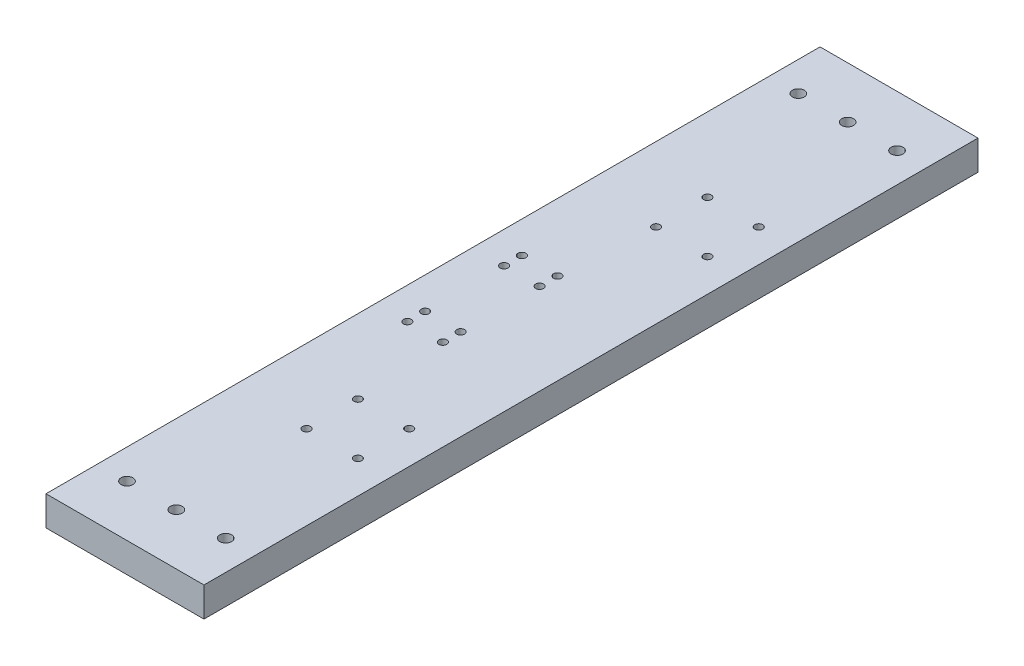
ISO-10303-21;
HEADER;
FILE_DESCRIPTION(('STEP AP214'),'2;1');
FILE_NAME('part.step','',(''),(''),'','','');
FILE_SCHEMA(('AUTOMOTIVE_DESIGN { 1 0 10303 214 1 1 1 1 }'));
ENDSEC;
DATA;
#1=APPLICATION_CONTEXT('core data for automotive mechanical design processes');
#2=APPLICATION_PROTOCOL_DEFINITION('international standard','automotive_design',2000,#1);
#3=PRODUCT_CONTEXT('',#1,'mechanical');
#4=PRODUCT('Part','Part','',(#3));
#5=PRODUCT_RELATED_PRODUCT_CATEGORY('part','',(#4));
#6=PRODUCT_DEFINITION_FORMATION('','',#4);
#7=PRODUCT_DEFINITION_CONTEXT('part definition',#1,'design');
#8=PRODUCT_DEFINITION('design','',#6,#7);
#9=PRODUCT_DEFINITION_SHAPE('','',#8);
#10=(LENGTH_UNIT() NAMED_UNIT(*) SI_UNIT(.MILLI.,.METRE.));
#11=(NAMED_UNIT(*) PLANE_ANGLE_UNIT() SI_UNIT($,.RADIAN.));
#12=(NAMED_UNIT(*) SI_UNIT($,.STERADIAN.) SOLID_ANGLE_UNIT());
#13=UNCERTAINTY_MEASURE_WITH_UNIT(LENGTH_MEASURE(1.E-05),#10,'distance_accuracy_value','');
#14=(GEOMETRIC_REPRESENTATION_CONTEXT(3) GLOBAL_UNCERTAINTY_ASSIGNED_CONTEXT((#13)) GLOBAL_UNIT_ASSIGNED_CONTEXT((#10,
#11,#12)) REPRESENTATION_CONTEXT('',''));
#15=CARTESIAN_POINT('',(0.,0.,0.));
#16=DIRECTION('',(0.,0.,1.));
#17=DIRECTION('',(1.,0.,0.));
#18=AXIS2_PLACEMENT_3D('',#15,#16,#17);
#19=CARTESIAN_POINT('',(0.,0.,392.));
#20=DIRECTION('',(1.,0.,0.));
#21=DIRECTION('',(0.,0.,-1.));
#22=AXIS2_PLACEMENT_3D('',#19,#20,#21);
#23=PLANE('',#22);
#24=DIRECTION('',(0.,-1.,0.));
#25=VECTOR('',#24,1.);
#26=CARTESIAN_POINT('',(0.,0.,0.));
#27=LINE('',#26,#25);
#28=CARTESIAN_POINT('',(0.,15.,0.));
#29=VERTEX_POINT('',#28);
#30=CARTESIAN_POINT('',(0.,0.,0.));
#31=VERTEX_POINT('',#30);
#32=EDGE_CURVE('E110',#29,#31,#27,.T.);
#33=ORIENTED_EDGE('',*,*,#32,.T.);
#34=DIRECTION('',(0.,0.,-1.));
#35=VECTOR('',#34,1.);
#36=CARTESIAN_POINT('',(0.,0.,392.));
#37=LINE('',#36,#35);
#38=CARTESIAN_POINT('',(0.,0.,392.));
#39=VERTEX_POINT('',#38);
#40=EDGE_CURVE('E11',#39,#31,#37,.T.);
#41=ORIENTED_EDGE('',*,*,#40,.F.);
#42=DIRECTION('',(0.,-1.,0.));
#43=VECTOR('',#42,1.);
#44=CARTESIAN_POINT('',(0.,0.,392.));
#45=LINE('',#44,#43);
#46=CARTESIAN_POINT('',(0.,15.,392.));
#47=VERTEX_POINT('',#46);
#48=EDGE_CURVE('E93',#47,#39,#45,.T.);
#49=ORIENTED_EDGE('',*,*,#48,.F.);
#50=DIRECTION('',(0.,0.,-1.));
#51=VECTOR('',#50,1.);
#52=CARTESIAN_POINT('',(0.,15.,392.));
#53=LINE('',#52,#51);
#54=EDGE_CURVE('E106',#47,#29,#53,.T.);
#55=ORIENTED_EDGE('',*,*,#54,.T.);
#56=EDGE_LOOP('',(#33,#41,#49,#55));
#57=FACE_BOUND('',#56,.T.);
#58=ADVANCED_FACE('F41',(#57),#23,.F.);
#59=CARTESIAN_POINT('',(0.,0.,392.));
#60=DIRECTION('',(0.,1.,0.));
#61=DIRECTION('',(0.,0.,1.));
#62=AXIS2_PLACEMENT_3D('',#59,#60,#61);
#63=PLANE('',#62);
#64=CARTESIAN_POINT('',(37.4499999999999,0.,94.5000000000002));
#65=DIRECTION('',(0.,1.,0.));
#66=DIRECTION('',(0.,0.,1.));
#67=AXIS2_PLACEMENT_3D('',#64,#65,#66);
#68=CIRCLE('',#67,2.);
#69=CARTESIAN_POINT('',(37.4499999999999,0.,96.5000000000002));
#70=VERTEX_POINT('',#69);
#71=EDGE_CURVE('E278',#70,#70,#68,.T.);
#72=ORIENTED_EDGE('',*,*,#71,.T.);
#73=EDGE_LOOP('',(#72));
#74=FACE_BOUND('',#73,.T.);
#75=CARTESIAN_POINT('',(37.45,0.,120.5));
#76=DIRECTION('',(0.,1.,0.));
#77=DIRECTION('',(0.,0.,1.));
#78=AXIS2_PLACEMENT_3D('',#75,#76,#77);
#79=CIRCLE('',#78,2.);
#80=CARTESIAN_POINT('',(37.45,0.,122.5));
#81=VERTEX_POINT('',#80);
#82=EDGE_CURVE('E270',#81,#81,#79,.T.);
#83=ORIENTED_EDGE('',*,*,#82,.T.);
#84=EDGE_LOOP('',(#83));
#85=FACE_BOUND('',#84,.T.);
#86=CARTESIAN_POINT('',(63.45,0.,120.5));
#87=DIRECTION('',(0.,1.,0.));
#88=DIRECTION('',(0.,0.,1.));
#89=AXIS2_PLACEMENT_3D('',#86,#87,#88);
#90=CIRCLE('',#89,2.);
#91=CARTESIAN_POINT('',(63.45,0.,122.5));
#92=VERTEX_POINT('',#91);
#93=EDGE_CURVE('E262',#92,#92,#90,.T.);
#94=ORIENTED_EDGE('',*,*,#93,.T.);
#95=EDGE_LOOP('',(#94));
#96=FACE_BOUND('',#95,.T.);
#97=CARTESIAN_POINT('',(63.45,0.,271.5));
#98=DIRECTION('',(0.,1.,0.));
#99=DIRECTION('',(0.,0.,-1.));
#100=AXIS2_PLACEMENT_3D('',#97,#98,#99);
#101=CIRCLE('',#100,2.);
#102=CARTESIAN_POINT('',(63.45,0.,269.5));
#103=VERTEX_POINT('',#102);
#104=EDGE_CURVE('E253',#103,#103,#101,.T.);
#105=ORIENTED_EDGE('',*,*,#104,.T.);
#106=EDGE_LOOP('',(#105));
#107=FACE_BOUND('',#106,.T.);
#108=CARTESIAN_POINT('',(37.45,0.,271.5));
#109=DIRECTION('',(0.,1.,0.));
#110=DIRECTION('',(0.,0.,-1.));
#111=AXIS2_PLACEMENT_3D('',#108,#109,#110);
#112=CIRCLE('',#111,2.);
#113=CARTESIAN_POINT('',(37.45,0.,269.5));
#114=VERTEX_POINT('',#113);
#115=EDGE_CURVE('E301',#114,#114,#112,.T.);
#116=ORIENTED_EDGE('',*,*,#115,.T.);
#117=EDGE_LOOP('',(#116));
#118=FACE_BOUND('',#117,.T.);
#119=CARTESIAN_POINT('',(37.4499999999999,0.,297.5));
#120=DIRECTION('',(0.,1.,0.));
#121=DIRECTION('',(0.,0.,-1.));
#122=AXIS2_PLACEMENT_3D('',#119,#120,#121);
#123=CIRCLE('',#122,2.);
#124=CARTESIAN_POINT('',(37.4499999999999,0.,295.5));
#125=VERTEX_POINT('',#124);
#126=EDGE_CURVE('E293',#125,#125,#123,.T.);
#127=ORIENTED_EDGE('',*,*,#126,.T.);
#128=EDGE_LOOP('',(#127));
#129=FACE_BOUND('',#128,.T.);
#130=CARTESIAN_POINT('',(63.4499999999999,0.,297.5));
#131=DIRECTION('',(0.,1.,0.));
#132=DIRECTION('',(0.,0.,-1.));
#133=AXIS2_PLACEMENT_3D('',#130,#131,#132);
#134=CIRCLE('',#133,2.);
#135=CARTESIAN_POINT('',(63.4499999999999,0.,295.5));
#136=VERTEX_POINT('',#135);
#137=EDGE_CURVE('E285',#136,#136,#134,.T.);
#138=ORIENTED_EDGE('',*,*,#137,.T.);
#139=EDGE_LOOP('',(#138));
#140=FACE_BOUND('',#139,.T.);
#141=CARTESIAN_POINT('',(63.4499999999999,0.,94.5000000000001));
#142=DIRECTION('',(0.,1.,0.));
#143=DIRECTION('',(0.,0.,1.));
#144=AXIS2_PLACEMENT_3D('',#141,#142,#143);
#145=CIRCLE('',#144,2.);
#146=CARTESIAN_POINT('',(63.4499999999999,0.,96.5000000000001));
#147=VERTEX_POINT('',#146);
#148=EDGE_CURVE('E226',#147,#147,#145,.T.);
#149=ORIENTED_EDGE('',*,*,#148,.T.);
#150=EDGE_LOOP('',(#149));
#151=FACE_BOUND('',#150,.T.);
#152=CARTESIAN_POINT('',(34.0000000000011,0.,225.));
#153=DIRECTION('',(0.,-1.,0.));
#154=DIRECTION('',(0.,0.,-1.));
#155=AXIS2_PLACEMENT_3D('',#152,#153,#154);
#156=CIRCLE('',#155,2.);
#157=CARTESIAN_POINT('',(34.0000000000011,0.,223.));
#158=VERTEX_POINT('',#157);
#159=EDGE_CURVE('E185',#158,#158,#156,.T.);
#160=ORIENTED_EDGE('',*,*,#159,.F.);
#161=EDGE_LOOP('',(#160));
#162=FACE_BOUND('',#161,.T.);
#163=CARTESIAN_POINT('',(16.0000000000011,0.,225.));
#164=DIRECTION('',(0.,-1.,0.));
#165=DIRECTION('',(0.,0.,-1.));
#166=AXIS2_PLACEMENT_3D('',#163,#164,#165);
#167=CIRCLE('',#166,2.);
#168=CARTESIAN_POINT('',(16.0000000000011,0.,223.));
#169=VERTEX_POINT('',#168);
#170=EDGE_CURVE('E210',#169,#169,#167,.T.);
#171=ORIENTED_EDGE('',*,*,#170,.F.);
#172=EDGE_LOOP('',(#171));
#173=FACE_BOUND('',#172,.T.);
#174=CARTESIAN_POINT('',(16.0000000000011,0.,216.));
#175=DIRECTION('',(0.,-1.,0.));
#176=DIRECTION('',(0.,0.,-1.));
#177=AXIS2_PLACEMENT_3D('',#174,#175,#176);
#178=CIRCLE('',#177,2.);
#179=CARTESIAN_POINT('',(16.0000000000011,0.,214.));
#180=VERTEX_POINT('',#179);
#181=EDGE_CURVE('E202',#180,#180,#178,.T.);
#182=ORIENTED_EDGE('',*,*,#181,.F.);
#183=EDGE_LOOP('',(#182));
#184=FACE_BOUND('',#183,.T.);
#185=CARTESIAN_POINT('',(15.9999999999999,0.,176.));
#186=DIRECTION('',(0.,-1.,0.));
#187=DIRECTION('',(0.,0.,1.));
#188=AXIS2_PLACEMENT_3D('',#185,#186,#187);
#189=CIRCLE('',#188,2.);
#190=CARTESIAN_POINT('',(15.9999999999999,0.,178.));
#191=VERTEX_POINT('',#190);
#192=EDGE_CURVE('E193',#191,#191,#189,.T.);
#193=ORIENTED_EDGE('',*,*,#192,.F.);
#194=EDGE_LOOP('',(#193));
#195=FACE_BOUND('',#194,.T.);
#196=CARTESIAN_POINT('',(16.0000000000011,0.,167.));
#197=DIRECTION('',(0.,-1.,0.));
#198=DIRECTION('',(0.,0.,1.));
#199=AXIS2_PLACEMENT_3D('',#196,#197,#198);
#200=CIRCLE('',#199,2.);
#201=CARTESIAN_POINT('',(16.0000000000011,0.,169.));
#202=VERTEX_POINT('',#201);
#203=EDGE_CURVE('E194',#202,#202,#200,.T.);
#204=ORIENTED_EDGE('',*,*,#203,.F.);
#205=EDGE_LOOP('',(#204));
#206=FACE_BOUND('',#205,.T.);
#207=CARTESIAN_POINT('',(34.0000000000011,0.,167.));
#208=DIRECTION('',(0.,-1.,0.));
#209=DIRECTION('',(0.,0.,1.));
#210=AXIS2_PLACEMENT_3D('',#207,#208,#209);
#211=CIRCLE('',#210,2.);
#212=CARTESIAN_POINT('',(34.0000000000011,0.,169.));
#213=VERTEX_POINT('',#212);
#214=EDGE_CURVE('E234',#213,#213,#211,.T.);
#215=ORIENTED_EDGE('',*,*,#214,.F.);
#216=EDGE_LOOP('',(#215));
#217=FACE_BOUND('',#216,.T.);
#218=CARTESIAN_POINT('',(33.9999999999999,0.,176.));
#219=DIRECTION('',(0.,-1.,0.));
#220=DIRECTION('',(0.,0.,1.));
#221=AXIS2_PLACEMENT_3D('',#218,#219,#220);
#222=CIRCLE('',#221,2.);
#223=CARTESIAN_POINT('',(33.9999999999999,0.,178.));
#224=VERTEX_POINT('',#223);
#225=EDGE_CURVE('E225',#224,#224,#222,.T.);
#226=ORIENTED_EDGE('',*,*,#225,.F.);
#227=EDGE_LOOP('',(#226));
#228=FACE_BOUND('',#227,.T.);
#229=CARTESIAN_POINT('',(34.0000000000011,0.,216.));
#230=DIRECTION('',(0.,-1.,0.));
#231=DIRECTION('',(0.,0.,-1.));
#232=AXIS2_PLACEMENT_3D('',#229,#230,#231);
#233=CIRCLE('',#232,2.);
#234=CARTESIAN_POINT('',(34.0000000000011,0.,214.));
#235=VERTEX_POINT('',#234);
#236=EDGE_CURVE('E181',#235,#235,#233,.T.);
#237=ORIENTED_EDGE('',*,*,#236,.F.);
#238=EDGE_LOOP('',(#237));
#239=FACE_BOUND('',#238,.T.);
#240=CARTESIAN_POINT('',(65.0000000000006,0.,366.));
#241=DIRECTION('',(0.,1.,0.));
#242=DIRECTION('',(0.,0.,-1.));
#243=AXIS2_PLACEMENT_3D('',#240,#241,#242);
#244=CIRCLE('',#243,3.00000000000001);
#245=CARTESIAN_POINT('',(65.0000000000006,0.,363.));
#246=VERTEX_POINT('',#245);
#247=EDGE_CURVE('E141',#246,#246,#244,.T.);
#248=ORIENTED_EDGE('',*,*,#247,.T.);
#249=EDGE_LOOP('',(#248));
#250=FACE_BOUND('',#249,.T.);
#251=CARTESIAN_POINT('',(40.0000000000006,0.,366.));
#252=DIRECTION('',(0.,1.,0.));
#253=DIRECTION('',(0.,0.,-1.));
#254=AXIS2_PLACEMENT_3D('',#251,#252,#253);
#255=CIRCLE('',#254,3.);
#256=CARTESIAN_POINT('',(40.0000000000006,0.,363.));
#257=VERTEX_POINT('',#256);
#258=EDGE_CURVE('E150',#257,#257,#255,.T.);
#259=ORIENTED_EDGE('',*,*,#258,.T.);
#260=EDGE_LOOP('',(#259));
#261=FACE_BOUND('',#260,.T.);
#262=CARTESIAN_POINT('',(15.0000000000006,0.,366.));
#263=DIRECTION('',(0.,1.,0.));
#264=DIRECTION('',(0.,0.,-1.));
#265=AXIS2_PLACEMENT_3D('',#262,#263,#264);
#266=CIRCLE('',#265,3.);
#267=CARTESIAN_POINT('',(15.0000000000006,0.,363.));
#268=VERTEX_POINT('',#267);
#269=EDGE_CURVE('E158',#268,#268,#266,.T.);
#270=ORIENTED_EDGE('',*,*,#269,.T.);
#271=EDGE_LOOP('',(#270));
#272=FACE_BOUND('',#271,.T.);
#273=CARTESIAN_POINT('',(15.0000000000019,0.,26.0000000000003));
#274=DIRECTION('',(0.,1.,0.));
#275=DIRECTION('',(0.,0.,1.));
#276=AXIS2_PLACEMENT_3D('',#273,#274,#275);
#277=CIRCLE('',#276,3.);
#278=CARTESIAN_POINT('',(15.0000000000019,0.,29.0000000000003));
#279=VERTEX_POINT('',#278);
#280=EDGE_CURVE('E166',#279,#279,#277,.T.);
#281=ORIENTED_EDGE('',*,*,#280,.T.);
#282=EDGE_LOOP('',(#281));
#283=FACE_BOUND('',#282,.T.);
#284=CARTESIAN_POINT('',(40.0000000000019,0.,26.0000000000004));
#285=DIRECTION('',(0.,1.,0.));
#286=DIRECTION('',(0.,0.,1.));
#287=AXIS2_PLACEMENT_3D('',#284,#285,#286);
#288=CIRCLE('',#287,3.);
#289=CARTESIAN_POINT('',(40.0000000000019,0.,29.0000000000004));
#290=VERTEX_POINT('',#289);
#291=EDGE_CURVE('E174',#290,#290,#288,.T.);
#292=ORIENTED_EDGE('',*,*,#291,.T.);
#293=EDGE_LOOP('',(#292));
#294=FACE_BOUND('',#293,.T.);
#295=CARTESIAN_POINT('',(65.0000000000019,0.,26.0000000000005));
#296=DIRECTION('',(0.,1.,0.));
#297=DIRECTION('',(0.,0.,1.));
#298=AXIS2_PLACEMENT_3D('',#295,#296,#297);
#299=CIRCLE('',#298,3.00000000000001);
#300=CARTESIAN_POINT('',(65.0000000000019,0.,29.0000000000005));
#301=VERTEX_POINT('',#300);
#302=EDGE_CURVE('E114',#301,#301,#299,.T.);
#303=ORIENTED_EDGE('',*,*,#302,.T.);
#304=EDGE_LOOP('',(#303));
#305=FACE_BOUND('',#304,.T.);
#306=DIRECTION('',(1.,0.,0.));
#307=VECTOR('',#306,1.);
#308=CARTESIAN_POINT('',(0.,0.,0.));
#309=LINE('',#308,#307);
#310=CARTESIAN_POINT('',(80.,0.,0.));
#311=VERTEX_POINT('',#310);
#312=EDGE_CURVE('E98',#31,#311,#309,.T.);
#313=ORIENTED_EDGE('',*,*,#312,.T.);
#314=DIRECTION('',(0.,0.,-1.));
#315=VECTOR('',#314,1.);
#316=CARTESIAN_POINT('',(80.,0.,392.));
#317=LINE('',#316,#315);
#318=CARTESIAN_POINT('',(80.,0.,392.));
#319=VERTEX_POINT('',#318);
#320=EDGE_CURVE('E50',#319,#311,#317,.T.);
#321=ORIENTED_EDGE('',*,*,#320,.F.);
#322=DIRECTION('',(1.,0.,0.));
#323=VECTOR('',#322,1.);
#324=CARTESIAN_POINT('',(0.,0.,392.));
#325=LINE('',#324,#323);
#326=EDGE_CURVE('E88',#39,#319,#325,.T.);
#327=ORIENTED_EDGE('',*,*,#326,.F.);
#328=ORIENTED_EDGE('',*,*,#40,.T.);
#329=EDGE_LOOP('',(#313,#321,#327,#328));
#330=FACE_BOUND('',#329,.T.);
#331=ADVANCED_FACE('F97',(#74,#85,#96,#107,#118,#129,#140,#151,#162,#173,#184,#195,#206,#217,
#228,#239,#250,#261,#272,#283,#294,#305,#330),#63,.F.);
#332=CARTESIAN_POINT('',(80.,0.,392.));
#333=DIRECTION('',(-1.,0.,0.));
#334=DIRECTION('',(0.,0.,1.));
#335=AXIS2_PLACEMENT_3D('',#332,#333,#334);
#336=PLANE('',#335);
#337=DIRECTION('',(0.,1.,0.));
#338=VECTOR('',#337,1.);
#339=CARTESIAN_POINT('',(80.,0.,0.));
#340=LINE('',#339,#338);
#341=CARTESIAN_POINT('',(80.,15.,0.));
#342=VERTEX_POINT('',#341);
#343=EDGE_CURVE('E75',#311,#342,#340,.T.);
#344=ORIENTED_EDGE('',*,*,#343,.T.);
#345=DIRECTION('',(0.,0.,-1.));
#346=VECTOR('',#345,1.);
#347=CARTESIAN_POINT('',(80.,15.,392.));
#348=LINE('',#347,#346);
#349=CARTESIAN_POINT('',(80.,15.,392.));
#350=VERTEX_POINT('',#349);
#351=EDGE_CURVE('E100',#350,#342,#348,.T.);
#352=ORIENTED_EDGE('',*,*,#351,.F.);
#353=DIRECTION('',(0.,1.,0.));
#354=VECTOR('',#353,1.);
#355=CARTESIAN_POINT('',(80.,0.,392.));
#356=LINE('',#355,#354);
#357=EDGE_CURVE('E91',#319,#350,#356,.T.);
#358=ORIENTED_EDGE('',*,*,#357,.F.);
#359=ORIENTED_EDGE('',*,*,#320,.T.);
#360=EDGE_LOOP('',(#344,#352,#358,#359));
#361=FACE_BOUND('',#360,.T.);
#362=ADVANCED_FACE('F101',(#361),#336,.F.);
#363=CARTESIAN_POINT('',(0.,15.,392.));
#364=DIRECTION('',(0.,-1.,0.));
#365=DIRECTION('',(0.,0.,-1.));
#366=AXIS2_PLACEMENT_3D('',#363,#364,#365);
#367=PLANE('',#366);
#368=CARTESIAN_POINT('',(37.4499999999999,15.,94.5000000000002));
#369=DIRECTION('',(0.,1.,0.));
#370=DIRECTION('',(0.,0.,1.));
#371=AXIS2_PLACEMENT_3D('',#368,#369,#370);
#372=CIRCLE('',#371,2.);
#373=CARTESIAN_POINT('',(37.4499999999999,15.,96.5000000000002));
#374=VERTEX_POINT('',#373);
#375=EDGE_CURVE('E249',#374,#374,#372,.T.);
#376=ORIENTED_EDGE('',*,*,#375,.F.);
#377=EDGE_LOOP('',(#376));
#378=FACE_BOUND('',#377,.T.);
#379=CARTESIAN_POINT('',(37.45,15.,120.5));
#380=DIRECTION('',(0.,1.,0.));
#381=DIRECTION('',(0.,0.,1.));
#382=AXIS2_PLACEMENT_3D('',#379,#380,#381);
#383=CIRCLE('',#382,2.);
#384=CARTESIAN_POINT('',(37.45,15.,122.5));
#385=VERTEX_POINT('',#384);
#386=EDGE_CURVE('E274',#385,#385,#383,.T.);
#387=ORIENTED_EDGE('',*,*,#386,.F.);
#388=EDGE_LOOP('',(#387));
#389=FACE_BOUND('',#388,.T.);
#390=CARTESIAN_POINT('',(63.45,15.,120.5));
#391=DIRECTION('',(0.,1.,0.));
#392=DIRECTION('',(0.,0.,1.));
#393=AXIS2_PLACEMENT_3D('',#390,#391,#392);
#394=CIRCLE('',#393,2.);
#395=CARTESIAN_POINT('',(63.45,15.,122.5));
#396=VERTEX_POINT('',#395);
#397=EDGE_CURVE('E266',#396,#396,#394,.T.);
#398=ORIENTED_EDGE('',*,*,#397,.F.);
#399=EDGE_LOOP('',(#398));
#400=FACE_BOUND('',#399,.T.);
#401=CARTESIAN_POINT('',(63.45,15.,271.5));
#402=DIRECTION('',(0.,1.,0.));
#403=DIRECTION('',(0.,0.,-1.));
#404=AXIS2_PLACEMENT_3D('',#401,#402,#403);
#405=CIRCLE('',#404,2.);
#406=CARTESIAN_POINT('',(63.45,15.,269.5));
#407=VERTEX_POINT('',#406);
#408=EDGE_CURVE('E257',#407,#407,#405,.T.);
#409=ORIENTED_EDGE('',*,*,#408,.F.);
#410=EDGE_LOOP('',(#409));
#411=FACE_BOUND('',#410,.T.);
#412=CARTESIAN_POINT('',(37.45,15.,271.5));
#413=DIRECTION('',(0.,1.,0.));
#414=DIRECTION('',(0.,0.,-1.));
#415=AXIS2_PLACEMENT_3D('',#412,#413,#414);
#416=CIRCLE('',#415,2.);
#417=CARTESIAN_POINT('',(37.45,15.,269.5));
#418=VERTEX_POINT('',#417);
#419=EDGE_CURVE('E258',#418,#418,#416,.T.);
#420=ORIENTED_EDGE('',*,*,#419,.F.);
#421=EDGE_LOOP('',(#420));
#422=FACE_BOUND('',#421,.T.);
#423=CARTESIAN_POINT('',(37.4499999999999,15.,297.5));
#424=DIRECTION('',(0.,1.,0.));
#425=DIRECTION('',(0.,0.,-1.));
#426=AXIS2_PLACEMENT_3D('',#423,#424,#425);
#427=CIRCLE('',#426,2.);
#428=CARTESIAN_POINT('',(37.4499999999999,15.,295.5));
#429=VERTEX_POINT('',#428);
#430=EDGE_CURVE('E297',#429,#429,#427,.T.);
#431=ORIENTED_EDGE('',*,*,#430,.F.);
#432=EDGE_LOOP('',(#431));
#433=FACE_BOUND('',#432,.T.);
#434=CARTESIAN_POINT('',(63.4499999999999,15.,297.5));
#435=DIRECTION('',(0.,1.,0.));
#436=DIRECTION('',(0.,0.,-1.));
#437=AXIS2_PLACEMENT_3D('',#434,#435,#436);
#438=CIRCLE('',#437,2.);
#439=CARTESIAN_POINT('',(63.4499999999999,15.,295.5));
#440=VERTEX_POINT('',#439);
#441=EDGE_CURVE('E289',#440,#440,#438,.T.);
#442=ORIENTED_EDGE('',*,*,#441,.F.);
#443=EDGE_LOOP('',(#442));
#444=FACE_BOUND('',#443,.T.);
#445=CARTESIAN_POINT('',(63.4499999999999,15.,94.5000000000001));
#446=DIRECTION('',(0.,1.,0.));
#447=DIRECTION('',(0.,0.,1.));
#448=AXIS2_PLACEMENT_3D('',#445,#446,#447);
#449=CIRCLE('',#448,2.);
#450=CARTESIAN_POINT('',(63.4499999999999,15.,96.5000000000001));
#451=VERTEX_POINT('',#450);
#452=EDGE_CURVE('E245',#451,#451,#449,.T.);
#453=ORIENTED_EDGE('',*,*,#452,.F.);
#454=EDGE_LOOP('',(#453));
#455=FACE_BOUND('',#454,.T.);
#456=CARTESIAN_POINT('',(34.0000000000011,15.,225.));
#457=DIRECTION('',(0.,-1.,0.));
#458=DIRECTION('',(0.,0.,-1.));
#459=AXIS2_PLACEMENT_3D('',#456,#457,#458);
#460=CIRCLE('',#459,2.);
#461=CARTESIAN_POINT('',(34.0000000000011,15.,223.));
#462=VERTEX_POINT('',#461);
#463=EDGE_CURVE('E214',#462,#462,#460,.T.);
#464=ORIENTED_EDGE('',*,*,#463,.T.);
#465=EDGE_LOOP('',(#464));
#466=FACE_BOUND('',#465,.T.);
#467=CARTESIAN_POINT('',(16.0000000000011,15.,225.));
#468=DIRECTION('',(0.,-1.,0.));
#469=DIRECTION('',(0.,0.,-1.));
#470=AXIS2_PLACEMENT_3D('',#467,#468,#469);
#471=CIRCLE('',#470,2.);
#472=CARTESIAN_POINT('',(16.0000000000011,15.,223.));
#473=VERTEX_POINT('',#472);
#474=EDGE_CURVE('E206',#473,#473,#471,.T.);
#475=ORIENTED_EDGE('',*,*,#474,.T.);
#476=EDGE_LOOP('',(#475));
#477=FACE_BOUND('',#476,.T.);
#478=CARTESIAN_POINT('',(16.0000000000011,15.,216.));
#479=DIRECTION('',(0.,-1.,0.));
#480=DIRECTION('',(0.,0.,-1.));
#481=AXIS2_PLACEMENT_3D('',#478,#479,#480);
#482=CIRCLE('',#481,2.);
#483=CARTESIAN_POINT('',(16.0000000000011,15.,214.));
#484=VERTEX_POINT('',#483);
#485=EDGE_CURVE('E198',#484,#484,#482,.T.);
#486=ORIENTED_EDGE('',*,*,#485,.T.);
#487=EDGE_LOOP('',(#486));
#488=FACE_BOUND('',#487,.T.);
#489=CARTESIAN_POINT('',(15.9999999999999,15.,176.));
#490=DIRECTION('',(0.,-1.,0.));
#491=DIRECTION('',(0.,0.,1.));
#492=AXIS2_PLACEMENT_3D('',#489,#490,#491);
#493=CIRCLE('',#492,2.);
#494=CARTESIAN_POINT('',(15.9999999999999,15.,178.));
#495=VERTEX_POINT('',#494);
#496=EDGE_CURVE('E189',#495,#495,#493,.T.);
#497=ORIENTED_EDGE('',*,*,#496,.T.);
#498=EDGE_LOOP('',(#497));
#499=FACE_BOUND('',#498,.T.);
#500=CARTESIAN_POINT('',(16.0000000000011,15.,167.));
#501=DIRECTION('',(0.,-1.,0.));
#502=DIRECTION('',(0.,0.,1.));
#503=AXIS2_PLACEMENT_3D('',#500,#501,#502);
#504=CIRCLE('',#503,2.);
#505=CARTESIAN_POINT('',(16.0000000000011,15.,169.));
#506=VERTEX_POINT('',#505);
#507=EDGE_CURVE('E238',#506,#506,#504,.T.);
#508=ORIENTED_EDGE('',*,*,#507,.T.);
#509=EDGE_LOOP('',(#508));
#510=FACE_BOUND('',#509,.T.);
#511=CARTESIAN_POINT('',(34.0000000000011,15.,167.));
#512=DIRECTION('',(0.,-1.,0.));
#513=DIRECTION('',(0.,0.,1.));
#514=AXIS2_PLACEMENT_3D('',#511,#512,#513);
#515=CIRCLE('',#514,2.);
#516=CARTESIAN_POINT('',(34.0000000000011,15.,169.));
#517=VERTEX_POINT('',#516);
#518=EDGE_CURVE('E230',#517,#517,#515,.T.);
#519=ORIENTED_EDGE('',*,*,#518,.T.);
#520=EDGE_LOOP('',(#519));
#521=FACE_BOUND('',#520,.T.);
#522=CARTESIAN_POINT('',(33.9999999999999,15.,176.));
#523=DIRECTION('',(0.,-1.,0.));
#524=DIRECTION('',(0.,0.,1.));
#525=AXIS2_PLACEMENT_3D('',#522,#523,#524);
#526=CIRCLE('',#525,2.);
#527=CARTESIAN_POINT('',(33.9999999999999,15.,178.));
#528=VERTEX_POINT('',#527);
#529=EDGE_CURVE('E221',#528,#528,#526,.T.);
#530=ORIENTED_EDGE('',*,*,#529,.T.);
#531=EDGE_LOOP('',(#530));
#532=FACE_BOUND('',#531,.T.);
#533=CARTESIAN_POINT('',(34.0000000000011,15.,216.));
#534=DIRECTION('',(0.,-1.,0.));
#535=DIRECTION('',(0.,0.,-1.));
#536=AXIS2_PLACEMENT_3D('',#533,#534,#535);
#537=CIRCLE('',#536,2.);
#538=CARTESIAN_POINT('',(34.0000000000011,15.,214.));
#539=VERTEX_POINT('',#538);
#540=EDGE_CURVE('E146',#539,#539,#537,.T.);
#541=ORIENTED_EDGE('',*,*,#540,.T.);
#542=EDGE_LOOP('',(#541));
#543=FACE_BOUND('',#542,.T.);
#544=CARTESIAN_POINT('',(65.0000000000006,15.,366.));
#545=DIRECTION('',(0.,1.,0.));
#546=DIRECTION('',(0.,0.,-1.));
#547=AXIS2_PLACEMENT_3D('',#544,#545,#546);
#548=CIRCLE('',#547,3.00000000000001);
#549=CARTESIAN_POINT('',(65.0000000000006,15.,363.));
#550=VERTEX_POINT('',#549);
#551=EDGE_CURVE('E145',#550,#550,#548,.T.);
#552=ORIENTED_EDGE('',*,*,#551,.F.);
#553=EDGE_LOOP('',(#552));
#554=FACE_BOUND('',#553,.T.);
#555=CARTESIAN_POINT('',(40.0000000000006,15.,366.));
#556=DIRECTION('',(0.,1.,0.));
#557=DIRECTION('',(0.,0.,-1.));
#558=AXIS2_PLACEMENT_3D('',#555,#556,#557);
#559=CIRCLE('',#558,3.);
#560=CARTESIAN_POINT('',(40.0000000000006,15.,363.));
#561=VERTEX_POINT('',#560);
#562=EDGE_CURVE('E154',#561,#561,#559,.T.);
#563=ORIENTED_EDGE('',*,*,#562,.F.);
#564=EDGE_LOOP('',(#563));
#565=FACE_BOUND('',#564,.T.);
#566=CARTESIAN_POINT('',(15.0000000000006,15.,366.));
#567=DIRECTION('',(0.,1.,0.));
#568=DIRECTION('',(0.,0.,-1.));
#569=AXIS2_PLACEMENT_3D('',#566,#567,#568);
#570=CIRCLE('',#569,3.);
#571=CARTESIAN_POINT('',(15.0000000000006,15.,363.));
#572=VERTEX_POINT('',#571);
#573=EDGE_CURVE('E162',#572,#572,#570,.T.);
#574=ORIENTED_EDGE('',*,*,#573,.F.);
#575=EDGE_LOOP('',(#574));
#576=FACE_BOUND('',#575,.T.);
#577=CARTESIAN_POINT('',(15.0000000000019,15.,26.0000000000003));
#578=DIRECTION('',(0.,1.,0.));
#579=DIRECTION('',(0.,0.,1.));
#580=AXIS2_PLACEMENT_3D('',#577,#578,#579);
#581=CIRCLE('',#580,3.);
#582=CARTESIAN_POINT('',(15.0000000000019,15.,29.0000000000003));
#583=VERTEX_POINT('',#582);
#584=EDGE_CURVE('E170',#583,#583,#581,.T.);
#585=ORIENTED_EDGE('',*,*,#584,.F.);
#586=EDGE_LOOP('',(#585));
#587=FACE_BOUND('',#586,.T.);
#588=CARTESIAN_POINT('',(40.0000000000019,15.,26.0000000000004));
#589=DIRECTION('',(0.,1.,0.));
#590=DIRECTION('',(0.,0.,1.));
#591=AXIS2_PLACEMENT_3D('',#588,#589,#590);
#592=CIRCLE('',#591,3.);
#593=CARTESIAN_POINT('',(40.0000000000019,15.,29.0000000000004));
#594=VERTEX_POINT('',#593);
#595=EDGE_CURVE('E137',#594,#594,#592,.T.);
#596=ORIENTED_EDGE('',*,*,#595,.F.);
#597=EDGE_LOOP('',(#596));
#598=FACE_BOUND('',#597,.T.);
#599=CARTESIAN_POINT('',(65.0000000000019,15.,26.0000000000005));
#600=DIRECTION('',(0.,1.,0.));
#601=DIRECTION('',(0.,0.,1.));
#602=AXIS2_PLACEMENT_3D('',#599,#600,#601);
#603=CIRCLE('',#602,3.00000000000001);
#604=CARTESIAN_POINT('',(65.0000000000019,15.,29.0000000000005));
#605=VERTEX_POINT('',#604);
#606=EDGE_CURVE('E133',#605,#605,#603,.T.);
#607=ORIENTED_EDGE('',*,*,#606,.F.);
#608=EDGE_LOOP('',(#607));
#609=FACE_BOUND('',#608,.T.);
#610=DIRECTION('',(-1.,0.,0.));
#611=VECTOR('',#610,1.);
#612=CARTESIAN_POINT('',(0.,15.,0.));
#613=LINE('',#612,#611);
#614=EDGE_CURVE('E81',#342,#29,#613,.T.);
#615=ORIENTED_EDGE('',*,*,#614,.T.);
#616=ORIENTED_EDGE('',*,*,#54,.F.);
#617=DIRECTION('',(-1.,0.,0.));
#618=VECTOR('',#617,1.);
#619=CARTESIAN_POINT('',(0.,15.,392.));
#620=LINE('',#619,#618);
#621=EDGE_CURVE('E58',#350,#47,#620,.T.);
#622=ORIENTED_EDGE('',*,*,#621,.F.);
#623=ORIENTED_EDGE('',*,*,#351,.T.);
#624=EDGE_LOOP('',(#615,#616,#622,#623));
#625=FACE_BOUND('',#624,.T.);
#626=ADVANCED_FACE('F125',(#378,#389,#400,#411,#422,#433,#444,#455,#466,#477,#488,#499,#510,
#521,#532,#543,#554,#565,#576,#587,#598,#609,#625),#367,.F.);
#627=CARTESIAN_POINT('',(0.,0.,392.));
#628=DIRECTION('',(0.,0.,-1.));
#629=DIRECTION('',(-1.,0.,0.));
#630=AXIS2_PLACEMENT_3D('',#627,#628,#629);
#631=PLANE('',#630);
#632=ORIENTED_EDGE('',*,*,#48,.T.);
#633=ORIENTED_EDGE('',*,*,#326,.T.);
#634=ORIENTED_EDGE('',*,*,#357,.T.);
#635=ORIENTED_EDGE('',*,*,#621,.T.);
#636=EDGE_LOOP('',(#632,#633,#634,#635));
#637=FACE_BOUND('',#636,.T.);
#638=ADVANCED_FACE('F89',(#637),#631,.F.);
#639=CARTESIAN_POINT('',(0.,0.,0.));
#640=DIRECTION('',(0.,0.,-1.));
#641=DIRECTION('',(-1.,0.,0.));
#642=AXIS2_PLACEMENT_3D('',#639,#640,#641);
#643=PLANE('',#642);
#644=ORIENTED_EDGE('',*,*,#32,.F.);
#645=ORIENTED_EDGE('',*,*,#614,.F.);
#646=ORIENTED_EDGE('',*,*,#343,.F.);
#647=ORIENTED_EDGE('',*,*,#312,.F.);
#648=EDGE_LOOP('',(#644,#645,#646,#647));
#649=FACE_BOUND('',#648,.T.);
#650=ADVANCED_FACE('F128',(#649),#643,.T.);
#651=CARTESIAN_POINT('',(65.0000000000019,0.,26.0000000000005));
#652=DIRECTION('',(0.,1.,0.));
#653=DIRECTION('',(0.,0.,1.));
#654=AXIS2_PLACEMENT_3D('',#651,#652,#653);
#655=CYLINDRICAL_SURFACE('',#654,3.00000000000001);
#656=ORIENTED_EDGE('',*,*,#302,.F.);
#657=EDGE_LOOP('',(#656));
#658=FACE_BOUND('',#657,.T.);
#659=ORIENTED_EDGE('',*,*,#606,.T.);
#660=EDGE_LOOP('',(#659));
#661=FACE_BOUND('',#660,.T.);
#662=ADVANCED_FACE('F350',(#658,#661),#655,.F.);
#663=CARTESIAN_POINT('',(40.0000000000019,0.,26.0000000000004));
#664=DIRECTION('',(0.,1.,0.));
#665=DIRECTION('',(0.,0.,1.));
#666=AXIS2_PLACEMENT_3D('',#663,#664,#665);
#667=CYLINDRICAL_SURFACE('',#666,3.);
#668=ORIENTED_EDGE('',*,*,#291,.F.);
#669=EDGE_LOOP('',(#668));
#670=FACE_BOUND('',#669,.T.);
#671=ORIENTED_EDGE('',*,*,#595,.T.);
#672=EDGE_LOOP('',(#671));
#673=FACE_BOUND('',#672,.T.);
#674=ADVANCED_FACE('F352',(#670,#673),#667,.F.);
#675=CARTESIAN_POINT('',(15.0000000000019,0.,26.0000000000003));
#676=DIRECTION('',(0.,1.,0.));
#677=DIRECTION('',(0.,0.,1.));
#678=AXIS2_PLACEMENT_3D('',#675,#676,#677);
#679=CYLINDRICAL_SURFACE('',#678,3.);
#680=ORIENTED_EDGE('',*,*,#280,.F.);
#681=EDGE_LOOP('',(#680));
#682=FACE_BOUND('',#681,.T.);
#683=ORIENTED_EDGE('',*,*,#584,.T.);
#684=EDGE_LOOP('',(#683));
#685=FACE_BOUND('',#684,.T.);
#686=ADVANCED_FACE('F359',(#682,#685),#679,.F.);
#687=CARTESIAN_POINT('',(15.0000000000006,0.,366.));
#688=DIRECTION('',(0.,1.,0.));
#689=DIRECTION('',(0.,0.,1.));
#690=AXIS2_PLACEMENT_3D('',#687,#688,#689);
#691=CYLINDRICAL_SURFACE('',#690,3.);
#692=ORIENTED_EDGE('',*,*,#269,.F.);
#693=EDGE_LOOP('',(#692));
#694=FACE_BOUND('',#693,.T.);
#695=ORIENTED_EDGE('',*,*,#573,.T.);
#696=EDGE_LOOP('',(#695));
#697=FACE_BOUND('',#696,.T.);
#698=ADVANCED_FACE('F408',(#694,#697),#691,.F.);
#699=CARTESIAN_POINT('',(40.0000000000006,0.,366.));
#700=DIRECTION('',(0.,1.,0.));
#701=DIRECTION('',(0.,0.,1.));
#702=AXIS2_PLACEMENT_3D('',#699,#700,#701);
#703=CYLINDRICAL_SURFACE('',#702,3.);
#704=ORIENTED_EDGE('',*,*,#258,.F.);
#705=EDGE_LOOP('',(#704));
#706=FACE_BOUND('',#705,.T.);
#707=ORIENTED_EDGE('',*,*,#562,.T.);
#708=EDGE_LOOP('',(#707));
#709=FACE_BOUND('',#708,.T.);
#710=ADVANCED_FACE('F419',(#706,#709),#703,.F.);
#711=CARTESIAN_POINT('',(65.0000000000006,0.,366.));
#712=DIRECTION('',(0.,1.,0.));
#713=DIRECTION('',(0.,0.,1.));
#714=AXIS2_PLACEMENT_3D('',#711,#712,#713);
#715=CYLINDRICAL_SURFACE('',#714,3.00000000000001);
#716=ORIENTED_EDGE('',*,*,#247,.F.);
#717=EDGE_LOOP('',(#716));
#718=FACE_BOUND('',#717,.T.);
#719=ORIENTED_EDGE('',*,*,#551,.T.);
#720=EDGE_LOOP('',(#719));
#721=FACE_BOUND('',#720,.T.);
#722=ADVANCED_FACE('F430',(#718,#721),#715,.F.);
#723=CARTESIAN_POINT('',(34.0000000000011,15.,216.));
#724=DIRECTION('',(0.,-1.,0.));
#725=DIRECTION('',(0.,0.,-1.));
#726=AXIS2_PLACEMENT_3D('',#723,#724,#725);
#727=CYLINDRICAL_SURFACE('',#726,2.);
#728=ORIENTED_EDGE('',*,*,#540,.F.);
#729=EDGE_LOOP('',(#728));
#730=FACE_BOUND('',#729,.T.);
#731=ORIENTED_EDGE('',*,*,#236,.T.);
#732=EDGE_LOOP('',(#731));
#733=FACE_BOUND('',#732,.T.);
#734=ADVANCED_FACE('F441',(#730,#733),#727,.F.);
#735=CARTESIAN_POINT('',(33.9999999999999,15.,176.));
#736=DIRECTION('',(0.,-1.,0.));
#737=DIRECTION('',(0.,0.,-1.));
#738=AXIS2_PLACEMENT_3D('',#735,#736,#737);
#739=CYLINDRICAL_SURFACE('',#738,2.);
#740=ORIENTED_EDGE('',*,*,#529,.F.);
#741=EDGE_LOOP('',(#740));
#742=FACE_BOUND('',#741,.T.);
#743=ORIENTED_EDGE('',*,*,#225,.T.);
#744=EDGE_LOOP('',(#743));
#745=FACE_BOUND('',#744,.T.);
#746=ADVANCED_FACE('F451',(#742,#745),#739,.F.);
#747=CARTESIAN_POINT('',(34.0000000000011,15.,167.));
#748=DIRECTION('',(0.,-1.,0.));
#749=DIRECTION('',(0.,0.,-1.));
#750=AXIS2_PLACEMENT_3D('',#747,#748,#749);
#751=CYLINDRICAL_SURFACE('',#750,2.);
#752=ORIENTED_EDGE('',*,*,#518,.F.);
#753=EDGE_LOOP('',(#752));
#754=FACE_BOUND('',#753,.T.);
#755=ORIENTED_EDGE('',*,*,#214,.T.);
#756=EDGE_LOOP('',(#755));
#757=FACE_BOUND('',#756,.T.);
#758=ADVANCED_FACE('F462',(#754,#757),#751,.F.);
#759=CARTESIAN_POINT('',(16.0000000000011,15.,167.));
#760=DIRECTION('',(0.,-1.,0.));
#761=DIRECTION('',(0.,0.,-1.));
#762=AXIS2_PLACEMENT_3D('',#759,#760,#761);
#763=CYLINDRICAL_SURFACE('',#762,2.);
#764=ORIENTED_EDGE('',*,*,#507,.F.);
#765=EDGE_LOOP('',(#764));
#766=FACE_BOUND('',#765,.T.);
#767=ORIENTED_EDGE('',*,*,#203,.T.);
#768=EDGE_LOOP('',(#767));
#769=FACE_BOUND('',#768,.T.);
#770=ADVANCED_FACE('F473',(#766,#769),#763,.F.);
#771=CARTESIAN_POINT('',(15.9999999999999,15.,176.));
#772=DIRECTION('',(0.,-1.,0.));
#773=DIRECTION('',(0.,0.,-1.));
#774=AXIS2_PLACEMENT_3D('',#771,#772,#773);
#775=CYLINDRICAL_SURFACE('',#774,2.);
#776=ORIENTED_EDGE('',*,*,#496,.F.);
#777=EDGE_LOOP('',(#776));
#778=FACE_BOUND('',#777,.T.);
#779=ORIENTED_EDGE('',*,*,#192,.T.);
#780=EDGE_LOOP('',(#779));
#781=FACE_BOUND('',#780,.T.);
#782=ADVANCED_FACE('F484',(#778,#781),#775,.F.);
#783=CARTESIAN_POINT('',(16.0000000000011,15.,216.));
#784=DIRECTION('',(0.,-1.,0.));
#785=DIRECTION('',(0.,0.,-1.));
#786=AXIS2_PLACEMENT_3D('',#783,#784,#785);
#787=CYLINDRICAL_SURFACE('',#786,2.);
#788=ORIENTED_EDGE('',*,*,#485,.F.);
#789=EDGE_LOOP('',(#788));
#790=FACE_BOUND('',#789,.T.);
#791=ORIENTED_EDGE('',*,*,#181,.T.);
#792=EDGE_LOOP('',(#791));
#793=FACE_BOUND('',#792,.T.);
#794=ADVANCED_FACE('F495',(#790,#793),#787,.F.);
#795=CARTESIAN_POINT('',(16.0000000000011,15.,225.));
#796=DIRECTION('',(0.,-1.,0.));
#797=DIRECTION('',(0.,0.,-1.));
#798=AXIS2_PLACEMENT_3D('',#795,#796,#797);
#799=CYLINDRICAL_SURFACE('',#798,2.);
#800=ORIENTED_EDGE('',*,*,#474,.F.);
#801=EDGE_LOOP('',(#800));
#802=FACE_BOUND('',#801,.T.);
#803=ORIENTED_EDGE('',*,*,#170,.T.);
#804=EDGE_LOOP('',(#803));
#805=FACE_BOUND('',#804,.T.);
#806=ADVANCED_FACE('F506',(#802,#805),#799,.F.);
#807=CARTESIAN_POINT('',(34.0000000000011,15.,225.));
#808=DIRECTION('',(0.,-1.,0.));
#809=DIRECTION('',(0.,0.,-1.));
#810=AXIS2_PLACEMENT_3D('',#807,#808,#809);
#811=CYLINDRICAL_SURFACE('',#810,2.);
#812=ORIENTED_EDGE('',*,*,#463,.F.);
#813=EDGE_LOOP('',(#812));
#814=FACE_BOUND('',#813,.T.);
#815=ORIENTED_EDGE('',*,*,#159,.T.);
#816=EDGE_LOOP('',(#815));
#817=FACE_BOUND('',#816,.T.);
#818=ADVANCED_FACE('F517',(#814,#817),#811,.F.);
#819=CARTESIAN_POINT('',(63.4499999999999,0.,94.5000000000001));
#820=DIRECTION('',(0.,1.,0.));
#821=DIRECTION('',(0.,0.,1.));
#822=AXIS2_PLACEMENT_3D('',#819,#820,#821);
#823=CYLINDRICAL_SURFACE('',#822,2.);
#824=ORIENTED_EDGE('',*,*,#148,.F.);
#825=EDGE_LOOP('',(#824));
#826=FACE_BOUND('',#825,.T.);
#827=ORIENTED_EDGE('',*,*,#452,.T.);
#828=EDGE_LOOP('',(#827));
#829=FACE_BOUND('',#828,.T.);
#830=ADVANCED_FACE('F527',(#826,#829),#823,.F.);
#831=CARTESIAN_POINT('',(63.4499999999999,0.,297.5));
#832=DIRECTION('',(0.,1.,0.));
#833=DIRECTION('',(0.,0.,1.));
#834=AXIS2_PLACEMENT_3D('',#831,#832,#833);
#835=CYLINDRICAL_SURFACE('',#834,2.);
#836=ORIENTED_EDGE('',*,*,#137,.F.);
#837=EDGE_LOOP('',(#836));
#838=FACE_BOUND('',#837,.T.);
#839=ORIENTED_EDGE('',*,*,#441,.T.);
#840=EDGE_LOOP('',(#839));
#841=FACE_BOUND('',#840,.T.);
#842=ADVANCED_FACE('F551',(#838,#841),#835,.F.);
#843=CARTESIAN_POINT('',(37.4499999999999,0.,297.5));
#844=DIRECTION('',(0.,1.,0.));
#845=DIRECTION('',(0.,0.,1.));
#846=AXIS2_PLACEMENT_3D('',#843,#844,#845);
#847=CYLINDRICAL_SURFACE('',#846,2.);
#848=ORIENTED_EDGE('',*,*,#126,.F.);
#849=EDGE_LOOP('',(#848));
#850=FACE_BOUND('',#849,.T.);
#851=ORIENTED_EDGE('',*,*,#430,.T.);
#852=EDGE_LOOP('',(#851));
#853=FACE_BOUND('',#852,.T.);
#854=ADVANCED_FACE('F562',(#850,#853),#847,.F.);
#855=CARTESIAN_POINT('',(37.45,0.,271.5));
#856=DIRECTION('',(0.,1.,0.));
#857=DIRECTION('',(0.,0.,1.));
#858=AXIS2_PLACEMENT_3D('',#855,#856,#857);
#859=CYLINDRICAL_SURFACE('',#858,2.);
#860=ORIENTED_EDGE('',*,*,#115,.F.);
#861=EDGE_LOOP('',(#860));
#862=FACE_BOUND('',#861,.T.);
#863=ORIENTED_EDGE('',*,*,#419,.T.);
#864=EDGE_LOOP('',(#863));
#865=FACE_BOUND('',#864,.T.);
#866=ADVANCED_FACE('F310',(#862,#865),#859,.F.);
#867=CARTESIAN_POINT('',(63.45,0.,271.5));
#868=DIRECTION('',(0.,1.,0.));
#869=DIRECTION('',(0.,0.,1.));
#870=AXIS2_PLACEMENT_3D('',#867,#868,#869);
#871=CYLINDRICAL_SURFACE('',#870,2.);
#872=ORIENTED_EDGE('',*,*,#104,.F.);
#873=EDGE_LOOP('',(#872));
#874=FACE_BOUND('',#873,.T.);
#875=ORIENTED_EDGE('',*,*,#408,.T.);
#876=EDGE_LOOP('',(#875));
#877=FACE_BOUND('',#876,.T.);
#878=ADVANCED_FACE('F583',(#874,#877),#871,.F.);
#879=CARTESIAN_POINT('',(63.45,0.,120.5));
#880=DIRECTION('',(0.,1.,0.));
#881=DIRECTION('',(0.,0.,1.));
#882=AXIS2_PLACEMENT_3D('',#879,#880,#881);
#883=CYLINDRICAL_SURFACE('',#882,2.);
#884=ORIENTED_EDGE('',*,*,#93,.F.);
#885=EDGE_LOOP('',(#884));
#886=FACE_BOUND('',#885,.T.);
#887=ORIENTED_EDGE('',*,*,#397,.T.);
#888=EDGE_LOOP('',(#887));
#889=FACE_BOUND('',#888,.T.);
#890=ADVANCED_FACE('F594',(#886,#889),#883,.F.);
#891=CARTESIAN_POINT('',(37.45,0.,120.5));
#892=DIRECTION('',(0.,1.,0.));
#893=DIRECTION('',(0.,0.,1.));
#894=AXIS2_PLACEMENT_3D('',#891,#892,#893);
#895=CYLINDRICAL_SURFACE('',#894,2.);
#896=ORIENTED_EDGE('',*,*,#82,.F.);
#897=EDGE_LOOP('',(#896));
#898=FACE_BOUND('',#897,.T.);
#899=ORIENTED_EDGE('',*,*,#386,.T.);
#900=EDGE_LOOP('',(#899));
#901=FACE_BOUND('',#900,.T.);
#902=ADVANCED_FACE('F605',(#898,#901),#895,.F.);
#903=CARTESIAN_POINT('',(37.4499999999999,0.,94.5000000000002));
#904=DIRECTION('',(0.,1.,0.));
#905=DIRECTION('',(0.,0.,1.));
#906=AXIS2_PLACEMENT_3D('',#903,#904,#905);
#907=CYLINDRICAL_SURFACE('',#906,2.);
#908=ORIENTED_EDGE('',*,*,#71,.F.);
#909=EDGE_LOOP('',(#908));
#910=FACE_BOUND('',#909,.T.);
#911=ORIENTED_EDGE('',*,*,#375,.T.);
#912=EDGE_LOOP('',(#911));
#913=FACE_BOUND('',#912,.T.);
#914=ADVANCED_FACE('F616',(#910,#913),#907,.F.);
#915=CLOSED_SHELL('',(#58,#331,#362,#626,#638,#650,#662,#674,#686,#698,#710,#722,#734,#746,#758,
#770,#782,#794,#806,#818,#830,#842,#854,#866,#878,#890,#902,#914));
#916=MANIFOLD_SOLID_BREP('B2',#915);
#917=ADVANCED_BREP_SHAPE_REPRESENTATION('',(#18,#916),#14);
#918=SHAPE_DEFINITION_REPRESENTATION(#9,#917);
ENDSEC;
END-ISO-10303-21;
